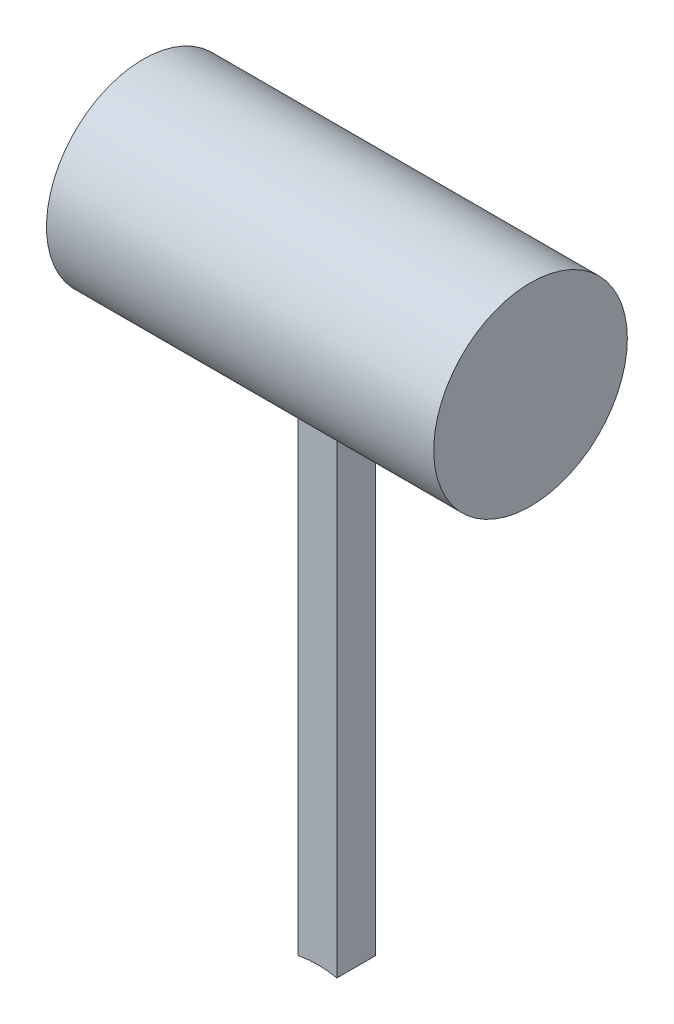
ISO-10303-21;
HEADER;
FILE_DESCRIPTION(('STEP AP214'),'2;1');
FILE_NAME('part.step','',(''),(''),'','','');
FILE_SCHEMA(('AUTOMOTIVE_DESIGN { 1 0 10303 214 1 1 1 1 }'));
ENDSEC;
DATA;
#1=APPLICATION_CONTEXT('core data for automotive mechanical design processes');
#2=APPLICATION_PROTOCOL_DEFINITION('international standard','automotive_design',2000,#1);
#3=PRODUCT_CONTEXT('',#1,'mechanical');
#4=PRODUCT('Part','Part','',(#3));
#5=PRODUCT_RELATED_PRODUCT_CATEGORY('part','',(#4));
#6=PRODUCT_DEFINITION_FORMATION('','',#4);
#7=PRODUCT_DEFINITION_CONTEXT('part definition',#1,'design');
#8=PRODUCT_DEFINITION('design','',#6,#7);
#9=PRODUCT_DEFINITION_SHAPE('','',#8);
#10=(LENGTH_UNIT() NAMED_UNIT(*) SI_UNIT(.MILLI.,.METRE.));
#11=(NAMED_UNIT(*) PLANE_ANGLE_UNIT() SI_UNIT($,.RADIAN.));
#12=(NAMED_UNIT(*) SI_UNIT($,.STERADIAN.) SOLID_ANGLE_UNIT());
#13=UNCERTAINTY_MEASURE_WITH_UNIT(LENGTH_MEASURE(1.E-05),#10,'distance_accuracy_value','');
#14=(GEOMETRIC_REPRESENTATION_CONTEXT(3) GLOBAL_UNCERTAINTY_ASSIGNED_CONTEXT((#13)) GLOBAL_UNIT_ASSIGNED_CONTEXT((#10,
#11,#12)) REPRESENTATION_CONTEXT('',''));
#15=CARTESIAN_POINT('',(0.,0.,0.));
#16=DIRECTION('',(0.,0.,1.));
#17=DIRECTION('',(1.,0.,0.));
#18=AXIS2_PLACEMENT_3D('',#15,#16,#17);
#19=CARTESIAN_POINT('',(10.,0.,0.));
#20=DIRECTION('',(-1.,0.,0.));
#21=DIRECTION('',(0.,0.,1.));
#22=AXIS2_PLACEMENT_3D('',#19,#20,#21);
#23=CYLINDRICAL_SURFACE('',#22,5.);
#24=CARTESIAN_POINT('',(-0.999999999999999,0.,0.));
#25=DIRECTION('',(1.,0.,0.));
#26=DIRECTION('',(0.,1.,0.));
#27=AXIS2_PLACEMENT_3D('',#24,#25,#26);
#28=CIRCLE('',#27,5.);
#29=CARTESIAN_POINT('',(-0.999999999999999,-4.89897948556635,1.));
#30=VERTEX_POINT('',#29);
#31=CARTESIAN_POINT('',(-1.,-4.89897948556635,-1.));
#32=VERTEX_POINT('',#31);
#33=EDGE_CURVE('E52',#30,#32,#28,.T.);
#34=ORIENTED_EDGE('',*,*,#33,.F.);
#35=DIRECTION('',(-1.,0.,0.));
#36=VECTOR('',#35,1.);
#37=CARTESIAN_POINT('',(10.,-4.89897948556635,1.));
#38=LINE('',#37,#36);
#39=CARTESIAN_POINT('',(1.,-4.89897948556635,1.));
#40=VERTEX_POINT('',#39);
#41=EDGE_CURVE('E11',#30,#40,#38,.F.);
#42=ORIENTED_EDGE('',*,*,#41,.T.);
#43=CARTESIAN_POINT('',(0.999999999999999,0.,0.));
#44=DIRECTION('',(1.,0.,0.));
#45=DIRECTION('',(0.,1.,0.));
#46=AXIS2_PLACEMENT_3D('',#43,#44,#45);
#47=CIRCLE('',#46,5.);
#48=CARTESIAN_POINT('',(1.,-4.89897948556635,-1.));
#49=VERTEX_POINT('',#48);
#50=EDGE_CURVE('E42',#40,#49,#47,.T.);
#51=ORIENTED_EDGE('',*,*,#50,.T.);
#52=DIRECTION('',(-1.,0.,0.));
#53=VECTOR('',#52,1.);
#54=CARTESIAN_POINT('',(10.,-4.89897948556635,-1.));
#55=LINE('',#54,#53);
#56=EDGE_CURVE('E106',#32,#49,#55,.F.);
#57=ORIENTED_EDGE('',*,*,#56,.F.);
#58=EDGE_LOOP('',(#34,#42,#51,#57));
#59=FACE_BOUND('',#58,.T.);
#60=CARTESIAN_POINT('',(10.,0.,0.));
#61=DIRECTION('',(1.,0.,0.));
#62=DIRECTION('',(0.,0.,-1.));
#63=AXIS2_PLACEMENT_3D('',#60,#61,#62);
#64=CIRCLE('',#63,5.);
#65=CARTESIAN_POINT('',(10.,0.,-5.));
#66=VERTEX_POINT('',#65);
#67=EDGE_CURVE('E103',#66,#66,#64,.T.);
#68=ORIENTED_EDGE('',*,*,#67,.F.);
#69=EDGE_LOOP('',(#68));
#70=FACE_BOUND('',#69,.T.);
#71=CARTESIAN_POINT('',(-10.,0.,0.));
#72=DIRECTION('',(1.,0.,0.));
#73=DIRECTION('',(0.,0.,-1.));
#74=AXIS2_PLACEMENT_3D('',#71,#72,#73);
#75=CIRCLE('',#74,5.);
#76=CARTESIAN_POINT('',(-10.,0.,-5.));
#77=VERTEX_POINT('',#76);
#78=EDGE_CURVE('E88',#77,#77,#75,.T.);
#79=ORIENTED_EDGE('',*,*,#78,.T.);
#80=EDGE_LOOP('',(#79));
#81=FACE_BOUND('',#80,.T.);
#82=ADVANCED_FACE('F35',(#59,#70,#81),#23,.T.);
#83=CARTESIAN_POINT('',(10.,0.,0.));
#84=DIRECTION('',(1.,0.,0.));
#85=DIRECTION('',(0.,0.,-1.));
#86=AXIS2_PLACEMENT_3D('',#83,#84,#85);
#87=PLANE('',#86);
#88=ORIENTED_EDGE('',*,*,#67,.T.);
#89=EDGE_LOOP('',(#88));
#90=FACE_BOUND('',#89,.T.);
#91=ADVANCED_FACE('F125',(#90),#87,.T.);
#92=CARTESIAN_POINT('',(-10.,0.,0.));
#93=DIRECTION('',(1.,0.,0.));
#94=DIRECTION('',(0.,0.,-1.));
#95=AXIS2_PLACEMENT_3D('',#92,#93,#94);
#96=PLANE('',#95);
#97=ORIENTED_EDGE('',*,*,#78,.F.);
#98=EDGE_LOOP('',(#97));
#99=FACE_BOUND('',#98,.T.);
#100=ADVANCED_FACE('F129',(#99),#96,.F.);
#101=CARTESIAN_POINT('',(0.,0.,1.));
#102=DIRECTION('',(0.,0.,1.));
#103=DIRECTION('',(1.,0.,0.));
#104=AXIS2_PLACEMENT_3D('',#101,#102,#103);
#105=PLANE('',#104);
#106=ORIENTED_EDGE('',*,*,#41,.F.);
#107=DIRECTION('',(0.,-1.,0.));
#108=VECTOR('',#107,1.);
#109=CARTESIAN_POINT('',(-1.,0.,1.));
#110=LINE('',#109,#108);
#111=CARTESIAN_POINT('',(-0.999999999999996,-30.1010205144336,1.));
#112=VERTEX_POINT('',#111);
#113=EDGE_CURVE('E79',#30,#112,#110,.T.);
#114=ORIENTED_EDGE('',*,*,#113,.T.);
#115=CARTESIAN_POINT('',(0.,-35.,1.));
#116=DIRECTION('',(0.,0.,1.));
#117=DIRECTION('',(1.,0.,0.));
#118=AXIS2_PLACEMENT_3D('',#115,#116,#117);
#119=CIRCLE('',#118,5.);
#120=CARTESIAN_POINT('',(1.00000000000001,-30.1010205144336,1.));
#121=VERTEX_POINT('',#120);
#122=EDGE_CURVE('E80',#121,#112,#119,.T.);
#123=ORIENTED_EDGE('',*,*,#122,.F.);
#124=DIRECTION('',(0.,-1.,0.));
#125=VECTOR('',#124,1.);
#126=CARTESIAN_POINT('',(1.,0.,1.));
#127=LINE('',#126,#125);
#128=EDGE_CURVE('E71',#40,#121,#127,.T.);
#129=ORIENTED_EDGE('',*,*,#128,.F.);
#130=EDGE_LOOP('',(#106,#114,#123,#129));
#131=FACE_BOUND('',#130,.T.);
#132=ADVANCED_FACE('F91',(#131),#105,.T.);
#133=CARTESIAN_POINT('',(0.,0.,-1.));
#134=DIRECTION('',(0.,0.,1.));
#135=DIRECTION('',(1.,0.,0.));
#136=AXIS2_PLACEMENT_3D('',#133,#134,#135);
#137=PLANE('',#136);
#138=DIRECTION('',(0.,-1.,0.));
#139=VECTOR('',#138,1.);
#140=CARTESIAN_POINT('',(-1.,0.,-1.));
#141=LINE('',#140,#139);
#142=CARTESIAN_POINT('',(-0.999999999999996,-30.1010205144336,-1.));
#143=VERTEX_POINT('',#142);
#144=EDGE_CURVE('E94',#32,#143,#141,.T.);
#145=ORIENTED_EDGE('',*,*,#144,.F.);
#146=ORIENTED_EDGE('',*,*,#56,.T.);
#147=DIRECTION('',(0.,-1.,0.));
#148=VECTOR('',#147,1.);
#149=CARTESIAN_POINT('',(1.,0.,-1.));
#150=LINE('',#149,#148);
#151=CARTESIAN_POINT('',(1.00000000000001,-30.1010205144336,-1.));
#152=VERTEX_POINT('',#151);
#153=EDGE_CURVE('E96',#49,#152,#150,.T.);
#154=ORIENTED_EDGE('',*,*,#153,.T.);
#155=CARTESIAN_POINT('',(0.,-35.,-1.));
#156=DIRECTION('',(0.,0.,1.));
#157=DIRECTION('',(1.,0.,0.));
#158=AXIS2_PLACEMENT_3D('',#155,#156,#157);
#159=CIRCLE('',#158,5.);
#160=EDGE_CURVE('E87',#152,#143,#159,.T.);
#161=ORIENTED_EDGE('',*,*,#160,.T.);
#162=EDGE_LOOP('',(#145,#146,#154,#161));
#163=FACE_BOUND('',#162,.T.);
#164=ADVANCED_FACE('F114',(#163),#137,.F.);
#165=CARTESIAN_POINT('',(0.,-35.,1.));
#166=DIRECTION('',(0.,0.,-1.));
#167=DIRECTION('',(-1.,0.,0.));
#168=AXIS2_PLACEMENT_3D('',#165,#166,#167);
#169=CYLINDRICAL_SURFACE('',#168,5.);
#170=ORIENTED_EDGE('',*,*,#160,.F.);
#171=DIRECTION('',(0.,0.,-1.));
#172=VECTOR('',#171,1.);
#173=CARTESIAN_POINT('',(1.00000000000001,-30.1010205144336,1.));
#174=LINE('',#173,#172);
#175=EDGE_CURVE('E75',#121,#152,#174,.T.);
#176=ORIENTED_EDGE('',*,*,#175,.F.);
#177=ORIENTED_EDGE('',*,*,#122,.T.);
#178=DIRECTION('',(0.,0.,-1.));
#179=VECTOR('',#178,1.);
#180=CARTESIAN_POINT('',(-0.999999999999996,-30.1010205144336,1.));
#181=LINE('',#180,#179);
#182=EDGE_CURVE('E89',#112,#143,#181,.T.);
#183=ORIENTED_EDGE('',*,*,#182,.T.);
#184=EDGE_LOOP('',(#170,#176,#177,#183));
#185=FACE_BOUND('',#184,.T.);
#186=ADVANCED_FACE('F84',(#185),#169,.F.);
#187=CARTESIAN_POINT('',(1.,0.,1.));
#188=DIRECTION('',(1.,0.,0.));
#189=DIRECTION('',(0.,1.,0.));
#190=AXIS2_PLACEMENT_3D('',#187,#188,#189);
#191=PLANE('',#190);
#192=ORIENTED_EDGE('',*,*,#50,.F.);
#193=ORIENTED_EDGE('',*,*,#128,.T.);
#194=ORIENTED_EDGE('',*,*,#175,.T.);
#195=ORIENTED_EDGE('',*,*,#153,.F.);
#196=EDGE_LOOP('',(#192,#193,#194,#195));
#197=FACE_BOUND('',#196,.T.);
#198=ADVANCED_FACE('F73',(#197),#191,.T.);
#199=CARTESIAN_POINT('',(-1.,0.,1.));
#200=DIRECTION('',(1.,0.,0.));
#201=DIRECTION('',(0.,1.,0.));
#202=AXIS2_PLACEMENT_3D('',#199,#200,#201);
#203=PLANE('',#202);
#204=ORIENTED_EDGE('',*,*,#113,.F.);
#205=ORIENTED_EDGE('',*,*,#33,.T.);
#206=ORIENTED_EDGE('',*,*,#144,.T.);
#207=ORIENTED_EDGE('',*,*,#182,.F.);
#208=EDGE_LOOP('',(#204,#205,#206,#207));
#209=FACE_BOUND('',#208,.T.);
#210=ADVANCED_FACE('F116',(#209),#203,.F.);
#211=CLOSED_SHELL('',(#82,#91,#100,#132,#164,#186,#198,#210));
#212=MANIFOLD_SOLID_BREP('B2',#211);
#213=ADVANCED_BREP_SHAPE_REPRESENTATION('',(#18,#212),#14);
#214=SHAPE_DEFINITION_REPRESENTATION(#9,#213);
ENDSEC;
END-ISO-10303-21;
